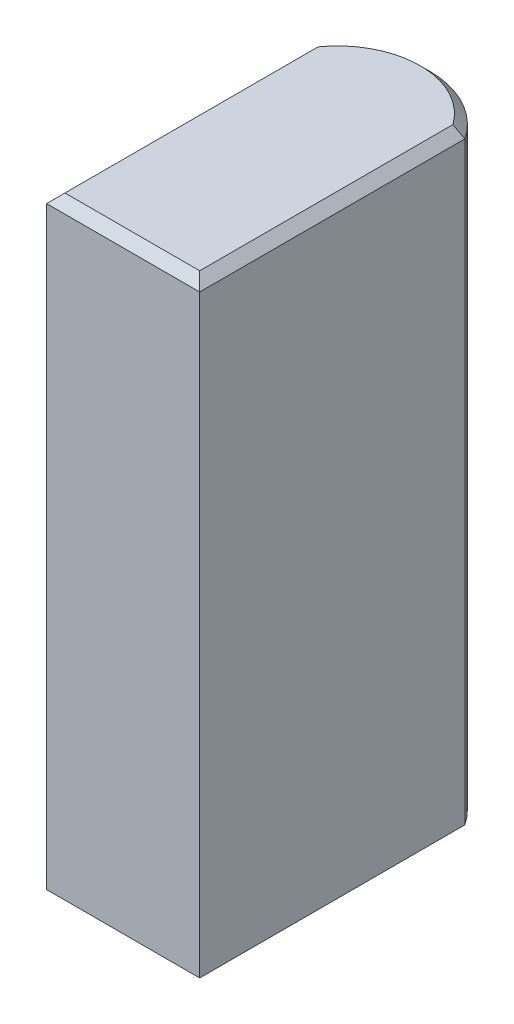
ISO-10303-21;
HEADER;
FILE_DESCRIPTION(('STEP AP214'),'2;1');
FILE_NAME('part.step','',(''),(''),'','','');
FILE_SCHEMA(('AUTOMOTIVE_DESIGN { 1 0 10303 214 1 1 1 1 }'));
ENDSEC;
DATA;
#1=APPLICATION_CONTEXT('core data for automotive mechanical design processes');
#2=APPLICATION_PROTOCOL_DEFINITION('international standard','automotive_design',2000,#1);
#3=PRODUCT_CONTEXT('',#1,'mechanical');
#4=PRODUCT('Part','Part','',(#3));
#5=PRODUCT_RELATED_PRODUCT_CATEGORY('part','',(#4));
#6=PRODUCT_DEFINITION_FORMATION('','',#4);
#7=PRODUCT_DEFINITION_CONTEXT('part definition',#1,'design');
#8=PRODUCT_DEFINITION('design','',#6,#7);
#9=PRODUCT_DEFINITION_SHAPE('','',#8);
#10=(LENGTH_UNIT() NAMED_UNIT(*) SI_UNIT(.MILLI.,.METRE.));
#11=(NAMED_UNIT(*) PLANE_ANGLE_UNIT() SI_UNIT($,.RADIAN.));
#12=(NAMED_UNIT(*) SI_UNIT($,.STERADIAN.) SOLID_ANGLE_UNIT());
#13=UNCERTAINTY_MEASURE_WITH_UNIT(LENGTH_MEASURE(1.E-05),#10,'distance_accuracy_value','');
#14=(GEOMETRIC_REPRESENTATION_CONTEXT(3) GLOBAL_UNCERTAINTY_ASSIGNED_CONTEXT((#13)) GLOBAL_UNIT_ASSIGNED_CONTEXT((#10,
#11,#12)) REPRESENTATION_CONTEXT('',''));
#15=CARTESIAN_POINT('',(0.,0.,0.));
#16=DIRECTION('',(0.,0.,1.));
#17=DIRECTION('',(1.,0.,0.));
#18=AXIS2_PLACEMENT_3D('',#15,#16,#17);
#19=CARTESIAN_POINT('',(0.,20.0000000000001,-7.00000000000009));
#20=DIRECTION('',(0.,-1.,0.));
#21=DIRECTION('',(0.,0.,-0.999999999999997));
#22=AXIS2_PLACEMENT_3D('',#19,#20,#21);
#23=CYLINDRICAL_SURFACE('',#22,3.);
#24=DIRECTION('',(0.,-1.,0.));
#25=VECTOR('',#24,1.);
#26=CARTESIAN_POINT('',(2.5,20.,-8.65831239517778));
#27=LINE('',#26,#25);
#28=CARTESIAN_POINT('',(2.5,19.7,-8.65831239517778));
#29=VERTEX_POINT('',#28);
#30=CARTESIAN_POINT('',(2.5,0.300000000000068,-8.65831239517762));
#31=VERTEX_POINT('',#30);
#32=EDGE_CURVE('E198',#29,#31,#27,.T.);
#33=ORIENTED_EDGE('',*,*,#32,.T.);
#34=CARTESIAN_POINT('',(0.,0.300000000000054,-6.99999999999996));
#35=DIRECTION('',(0.,-1.,0.));
#36=DIRECTION('',(0.,0.,-0.999999999999997));
#37=AXIS2_PLACEMENT_3D('',#34,#35,#36);
#38=CIRCLE('',#37,3.);
#39=CARTESIAN_POINT('',(-2.5,0.300000000000068,-8.65831239517762));
#40=VERTEX_POINT('',#39);
#41=EDGE_CURVE('E240',#31,#40,#38,.F.);
#42=ORIENTED_EDGE('',*,*,#41,.T.);
#43=DIRECTION('',(0.,-1.,0.));
#44=VECTOR('',#43,1.);
#45=CARTESIAN_POINT('',(-2.5,20.,-8.65831239517778));
#46=LINE('',#45,#44);
#47=CARTESIAN_POINT('',(-2.5,19.7,-8.65831239517778));
#48=VERTEX_POINT('',#47);
#49=EDGE_CURVE('E137',#48,#40,#46,.T.);
#50=ORIENTED_EDGE('',*,*,#49,.F.);
#51=CARTESIAN_POINT('',(0.,19.7000000000001,-7.00000000000012));
#52=DIRECTION('',(0.,-1.,0.));
#53=DIRECTION('',(0.,0.,-0.999999999999997));
#54=AXIS2_PLACEMENT_3D('',#51,#52,#53);
#55=CIRCLE('',#54,3.);
#56=EDGE_CURVE('E243',#48,#29,#55,.T.);
#57=ORIENTED_EDGE('',*,*,#56,.T.);
#58=EDGE_LOOP('',(#33,#42,#50,#57));
#59=FACE_BOUND('',#58,.T.);
#60=ADVANCED_FACE('F46',(#59),#23,.T.);
#61=CARTESIAN_POINT('',(-2.5,20.,-1.66533453693773E-13));
#62=DIRECTION('',(1.,0.,0.));
#63=DIRECTION('',(0.,0.,-0.999999999999997));
#64=AXIS2_PLACEMENT_3D('',#61,#62,#63);
#65=PLANE('',#64);
#66=ORIENTED_EDGE('',*,*,#49,.T.);
#67=DIRECTION('',(0.,0.,0.999999999999997));
#68=VECTOR('',#67,1.);
#69=CARTESIAN_POINT('',(-2.5,0.299999999999998,0.));
#70=LINE('',#69,#68);
#71=CARTESIAN_POINT('',(-2.5,0.299999999999998,0.));
#72=VERTEX_POINT('',#71);
#73=EDGE_CURVE('E135',#40,#72,#70,.T.);
#74=ORIENTED_EDGE('',*,*,#73,.T.);
#75=DIRECTION('',(0.,-1.,0.));
#76=VECTOR('',#75,1.);
#77=CARTESIAN_POINT('',(-2.5,20.,-1.66533453693773E-13));
#78=LINE('',#77,#76);
#79=CARTESIAN_POINT('',(-2.5,19.7,-1.66533453693773E-13));
#80=VERTEX_POINT('',#79);
#81=EDGE_CURVE('E117',#80,#72,#78,.T.);
#82=ORIENTED_EDGE('',*,*,#81,.F.);
#83=DIRECTION('',(0.,0.,-0.999999999999997));
#84=VECTOR('',#83,1.);
#85=CARTESIAN_POINT('',(-2.5,19.7,-1.66533453693773E-13));
#86=LINE('',#85,#84);
#87=EDGE_CURVE('E132',#80,#48,#86,.T.);
#88=ORIENTED_EDGE('',*,*,#87,.T.);
#89=EDGE_LOOP('',(#66,#74,#82,#88));
#90=FACE_BOUND('',#89,.T.);
#91=ADVANCED_FACE('F131',(#90),#65,.F.);
#92=CARTESIAN_POINT('',(2.5,20.,-1.66533453693773E-13));
#93=DIRECTION('',(0.,0.,-0.999999999999997));
#94=DIRECTION('',(-1.,0.,0.));
#95=AXIS2_PLACEMENT_3D('',#92,#93,#94);
#96=PLANE('',#95);
#97=ORIENTED_EDGE('',*,*,#81,.T.);
#98=DIRECTION('',(1.,0.,0.));
#99=VECTOR('',#98,1.);
#100=CARTESIAN_POINT('',(2.5,0.299999999999998,0.));
#101=LINE('',#100,#99);
#102=CARTESIAN_POINT('',(2.5,0.299999999999998,0.));
#103=VERTEX_POINT('',#102);
#104=EDGE_CURVE('E124',#72,#103,#101,.T.);
#105=ORIENTED_EDGE('',*,*,#104,.T.);
#106=DIRECTION('',(0.,-1.,0.));
#107=VECTOR('',#106,1.);
#108=CARTESIAN_POINT('',(2.5,20.,-1.66533453693773E-13));
#109=LINE('',#108,#107);
#110=CARTESIAN_POINT('',(2.5,19.7,-1.66533453693773E-13));
#111=VERTEX_POINT('',#110);
#112=EDGE_CURVE('E119',#111,#103,#109,.T.);
#113=ORIENTED_EDGE('',*,*,#112,.F.);
#114=DIRECTION('',(-1.,0.,0.));
#115=VECTOR('',#114,1.);
#116=CARTESIAN_POINT('',(2.5,19.7,-1.66533453693773E-13));
#117=LINE('',#116,#115);
#118=EDGE_CURVE('E114',#111,#80,#117,.T.);
#119=ORIENTED_EDGE('',*,*,#118,.T.);
#120=EDGE_LOOP('',(#97,#105,#113,#119));
#121=FACE_BOUND('',#120,.T.);
#122=ADVANCED_FACE('F116',(#121),#96,.F.);
#123=CARTESIAN_POINT('',(2.5,20.,-1.66533453693773E-13));
#124=DIRECTION('',(-1.,0.,0.));
#125=DIRECTION('',(0.,0.,0.999999999999997));
#126=AXIS2_PLACEMENT_3D('',#123,#124,#125);
#127=PLANE('',#126);
#128=ORIENTED_EDGE('',*,*,#112,.T.);
#129=DIRECTION('',(0.,0.,-0.999999999999997));
#130=VECTOR('',#129,1.);
#131=CARTESIAN_POINT('',(2.5,0.300000000000068,-8.65831239517762));
#132=LINE('',#131,#130);
#133=EDGE_CURVE('E246',#103,#31,#132,.T.);
#134=ORIENTED_EDGE('',*,*,#133,.T.);
#135=ORIENTED_EDGE('',*,*,#32,.F.);
#136=DIRECTION('',(0.,0.,0.999999999999997));
#137=VECTOR('',#136,1.);
#138=CARTESIAN_POINT('',(2.5,19.7,-1.66533453693773E-13));
#139=LINE('',#138,#137);
#140=EDGE_CURVE('E249',#29,#111,#139,.T.);
#141=ORIENTED_EDGE('',*,*,#140,.T.);
#142=EDGE_LOOP('',(#128,#134,#135,#141));
#143=FACE_BOUND('',#142,.T.);
#144=ADVANCED_FACE('F291',(#143),#127,.F.);
#145=CARTESIAN_POINT('',(0.,20.0000000000001,-7.00000000000009));
#146=DIRECTION('',(0.,-1.,0.));
#147=DIRECTION('',(0.,0.,-0.999999999999997));
#148=AXIS2_PLACEMENT_3D('',#145,#146,#147);
#149=PLANE('',#148);
#150=DIRECTION('',(1.,0.,0.));
#151=VECTOR('',#150,1.);
#152=CARTESIAN_POINT('',(0.,20.,-0.300000000000168));
#153=LINE('',#152,#151);
#154=CARTESIAN_POINT('',(-2.2,20.,-0.300000000000168));
#155=VERTEX_POINT('',#154);
#156=CARTESIAN_POINT('',(2.2,20.,-0.300000000000168));
#157=VERTEX_POINT('',#156);
#158=EDGE_CURVE('E57',#155,#157,#153,.T.);
#159=ORIENTED_EDGE('',*,*,#158,.T.);
#160=DIRECTION('',(0.,0.,-0.999999999999997));
#161=VECTOR('',#160,1.);
#162=CARTESIAN_POINT('',(2.2,20.0000000000001,-7.00000000000009));
#163=LINE('',#162,#161);
#164=CARTESIAN_POINT('',(2.19999999999979,20.,-8.56524758425023));
#165=VERTEX_POINT('',#164);
#166=EDGE_CURVE('E11',#157,#165,#163,.T.);
#167=ORIENTED_EDGE('',*,*,#166,.T.);
#168=CARTESIAN_POINT('',(0.,20.0000000000001,-7.00000000000009));
#169=DIRECTION('',(0.,-1.,0.));
#170=DIRECTION('',(0.,0.,-0.999999999999997));
#171=AXIS2_PLACEMENT_3D('',#168,#169,#170);
#172=CIRCLE('',#171,2.7);
#173=CARTESIAN_POINT('',(-2.19999999999979,20.,-8.56524758425023));
#174=VERTEX_POINT('',#173);
#175=EDGE_CURVE('E237',#165,#174,#172,.F.);
#176=ORIENTED_EDGE('',*,*,#175,.T.);
#177=DIRECTION('',(0.,0.,0.999999999999997));
#178=VECTOR('',#177,1.);
#179=CARTESIAN_POINT('',(-2.2,20.0000000000001,-7.00000000000009));
#180=LINE('',#179,#178);
#181=EDGE_CURVE('E68',#174,#155,#180,.T.);
#182=ORIENTED_EDGE('',*,*,#181,.T.);
#183=EDGE_LOOP('',(#159,#167,#176,#182));
#184=FACE_BOUND('',#183,.T.);
#185=ADVANCED_FACE('F294',(#184),#149,.F.);
#186=CARTESIAN_POINT('',(0.,0.,-6.99999999999996));
#187=DIRECTION('',(0.,-1.,0.));
#188=DIRECTION('',(0.,0.,-0.999999999999997));
#189=AXIS2_PLACEMENT_3D('',#186,#187,#188);
#190=PLANE('',#189);
#191=DIRECTION('',(-1.,0.,0.));
#192=VECTOR('',#191,1.);
#193=CARTESIAN_POINT('',(-2.5,0.,-0.300000000000002));
#194=LINE('',#193,#192);
#195=CARTESIAN_POINT('',(2.2,0.,-0.300000000000002));
#196=VERTEX_POINT('',#195);
#197=CARTESIAN_POINT('',(-2.2,0.,-0.300000000000002));
#198=VERTEX_POINT('',#197);
#199=EDGE_CURVE('E257',#196,#198,#194,.T.);
#200=ORIENTED_EDGE('',*,*,#199,.T.);
#201=DIRECTION('',(0.,0.,-0.999999999999997));
#202=VECTOR('',#201,1.);
#203=CARTESIAN_POINT('',(-2.2,0.,-8.65831239517762));
#204=LINE('',#203,#202);
#205=CARTESIAN_POINT('',(-2.19999999999979,0.,-8.56524758425007));
#206=VERTEX_POINT('',#205);
#207=EDGE_CURVE('E125',#198,#206,#204,.T.);
#208=ORIENTED_EDGE('',*,*,#207,.T.);
#209=CARTESIAN_POINT('',(0.,0.,-6.99999999999996));
#210=DIRECTION('',(0.,-1.,0.));
#211=DIRECTION('',(0.,0.,-0.999999999999997));
#212=AXIS2_PLACEMENT_3D('',#209,#210,#211);
#213=CIRCLE('',#212,2.7);
#214=CARTESIAN_POINT('',(2.19999999999979,0.,-8.56524758425007));
#215=VERTEX_POINT('',#214);
#216=EDGE_CURVE('E263',#206,#215,#213,.T.);
#217=ORIENTED_EDGE('',*,*,#216,.T.);
#218=DIRECTION('',(0.,0.,0.999999999999997));
#219=VECTOR('',#218,1.);
#220=CARTESIAN_POINT('',(2.2,0.,0.));
#221=LINE('',#220,#219);
#222=EDGE_CURVE('E260',#215,#196,#221,.T.);
#223=ORIENTED_EDGE('',*,*,#222,.T.);
#224=EDGE_LOOP('',(#200,#208,#217,#223));
#225=FACE_BOUND('',#224,.T.);
#226=ADVANCED_FACE('F214',(#225),#190,.T.);
#227=CARTESIAN_POINT('',(2.5,0.299999999999998,0.));
#228=DIRECTION('',(0.707106781186545,-0.70710678118655,0.));
#229=DIRECTION('',(0.,0.,0.999999999999997));
#230=AXIS2_PLACEMENT_3D('',#227,#228,#229);
#231=PLANE('',#230);
#232=DIRECTION('',(-0.577350269189628,-0.577350269189619,-0.57735026918962));
#233=VECTOR('',#232,1.);
#234=CARTESIAN_POINT('',(2.5,0.299999999999998,0.));
#235=LINE('',#234,#233);
#236=EDGE_CURVE('E199',#196,#103,#235,.F.);
#237=ORIENTED_EDGE('',*,*,#236,.F.);
#238=ORIENTED_EDGE('',*,*,#222,.F.);
#239=CARTESIAN_POINT('',(2.5,0.300000000000068,-8.65831239517762));
#240=CARTESIAN_POINT('',(2.44993376791135,0.249933767911329,-8.64322876187367));
#241=CARTESIAN_POINT('',(2.3999006638598,0.199900663859727,-8.62793154813898));
#242=CARTESIAN_POINT('',(2.29990066379614,0.0999006637960669,-8.59690994490694));
#243=CARTESIAN_POINT('',(2.24993376784768,0.0499337678476608,-8.58118555499922));
#244=CARTESIAN_POINT('',(2.19999999999997,0.,-8.56524758425039));
#245=B_SPLINE_CURVE_WITH_KNOTS('',3,(#239,#240,#241,#242,#243,#244),.UNSPECIFIED.,.F.,.F.,(4,2,
4),(0.,0.217176540517284,0.434353289674991),.UNSPECIFIED.);
#246=EDGE_CURVE('E189',#31,#215,#245,.T.);
#247=ORIENTED_EDGE('',*,*,#246,.F.);
#248=ORIENTED_EDGE('',*,*,#133,.F.);
#249=EDGE_LOOP('',(#237,#238,#247,#248));
#250=FACE_BOUND('',#249,.T.);
#251=ADVANCED_FACE('F207',(#250),#231,.T.);
#252=CARTESIAN_POINT('',(0.,0.300000000000054,-6.99999999999996));
#253=DIRECTION('',(0.,1.,0.));
#254=DIRECTION('',(0.,0.,0.999999999999997));
#255=AXIS2_PLACEMENT_3D('',#252,#253,#254);
#256=CONICAL_SURFACE('',#255,3.,0.785398163397451);
#257=ORIENTED_EDGE('',*,*,#246,.T.);
#258=ORIENTED_EDGE('',*,*,#216,.F.);
#259=CARTESIAN_POINT('',(-2.2,0.,-8.56524758425021));
#260=CARTESIAN_POINT('',(-2.24993376784771,0.0499337678476907,-8.58118555499902));
#261=CARTESIAN_POINT('',(-2.29990066379616,0.0999006637960875,-8.59690994490679));
#262=CARTESIAN_POINT('',(-2.39990066385977,0.199900663859702,-8.62793154813912));
#263=CARTESIAN_POINT('',(-2.44993376791129,0.249933767911268,-8.64322876187405));
#264=CARTESIAN_POINT('',(-2.49999999999989,0.299999999999956,-8.65831239517832));
#265=B_SPLINE_CURVE_WITH_KNOTS('',3,(#259,#260,#261,#262,#263,#264),.UNSPECIFIED.,.F.,.F.,(4,2,
4),(0.,0.217176749157705,0.434353289674987),.UNSPECIFIED.);
#266=EDGE_CURVE('E151',#40,#206,#265,.F.);
#267=ORIENTED_EDGE('',*,*,#266,.F.);
#268=ORIENTED_EDGE('',*,*,#41,.F.);
#269=EDGE_LOOP('',(#257,#258,#267,#268));
#270=FACE_BOUND('',#269,.T.);
#271=ADVANCED_FACE('F202',(#270),#256,.T.);
#272=CARTESIAN_POINT('',(2.5,0.299999999999998,0.));
#273=DIRECTION('',(0.,-0.707106781186555,0.707106781186548));
#274=DIRECTION('',(-1.,0.,0.));
#275=AXIS2_PLACEMENT_3D('',#272,#273,#274);
#276=PLANE('',#275);
#277=ORIENTED_EDGE('',*,*,#236,.T.);
#278=ORIENTED_EDGE('',*,*,#104,.F.);
#279=DIRECTION('',(0.577350269189628,-0.577350269189619,-0.57735026918962));
#280=VECTOR('',#279,1.);
#281=CARTESIAN_POINT('',(-0.833333333333322,-1.36666666666665,-1.66666666666668));
#282=LINE('',#281,#280);
#283=EDGE_CURVE('E148',#198,#72,#282,.F.);
#284=ORIENTED_EDGE('',*,*,#283,.F.);
#285=ORIENTED_EDGE('',*,*,#199,.F.);
#286=EDGE_LOOP('',(#277,#278,#284,#285));
#287=FACE_BOUND('',#286,.T.);
#288=ADVANCED_FACE('F216',(#287),#276,.T.);
#289=CARTESIAN_POINT('',(-2.5,0.299999999999998,0.));
#290=DIRECTION('',(-0.707106781186545,-0.70710678118655,0.));
#291=DIRECTION('',(0.,0.,-0.999999999999997));
#292=AXIS2_PLACEMENT_3D('',#289,#290,#291);
#293=PLANE('',#292);
#294=ORIENTED_EDGE('',*,*,#266,.T.);
#295=ORIENTED_EDGE('',*,*,#207,.F.);
#296=ORIENTED_EDGE('',*,*,#283,.T.);
#297=ORIENTED_EDGE('',*,*,#73,.F.);
#298=EDGE_LOOP('',(#294,#295,#296,#297));
#299=FACE_BOUND('',#298,.T.);
#300=ADVANCED_FACE('F176',(#299),#293,.T.);
#301=CARTESIAN_POINT('',(-2.2,20.0000000000001,-7.00000000000009));
#302=DIRECTION('',(0.707106781186551,-0.707106781186544,0.));
#303=DIRECTION('',(0.,0.,0.999999999999997));
#304=AXIS2_PLACEMENT_3D('',#301,#302,#303);
#305=PLANE('',#304);
#306=CARTESIAN_POINT('',(-2.5,19.7,-8.65831239517778));
#307=CARTESIAN_POINT('',(-2.4499337679113,19.7500662320888,-8.64322876187393));
#308=CARTESIAN_POINT('',(-2.39990066385972,19.8000993361403,-8.62793154813928));
#309=CARTESIAN_POINT('',(-2.29990066379606,19.900099336204,-8.59690994490724));
#310=CARTESIAN_POINT('',(-2.24993376784763,19.9500662321524,-8.58118555499948));
#311=CARTESIAN_POINT('',(-2.19999999999997,20.0000000000001,-8.56524758425055));
#312=B_SPLINE_CURVE_WITH_KNOTS('',3,(#306,#307,#308,#309,#310,#311),.UNSPECIFIED.,.F.,.F.,(4,2,
4),(0.,0.21717654051729,0.434353289674998),.UNSPECIFIED.);
#313=EDGE_CURVE('E143',#48,#174,#312,.T.);
#314=ORIENTED_EDGE('',*,*,#313,.F.);
#315=ORIENTED_EDGE('',*,*,#87,.F.);
#316=DIRECTION('',(0.577350269189624,0.577350269189634,-0.577350269189624));
#317=VECTOR('',#316,1.);
#318=CARTESIAN_POINT('',(0.0333333333333188,22.2333333333333,-2.53333333333344));
#319=LINE('',#318,#317);
#320=EDGE_CURVE('E51',#155,#80,#319,.F.);
#321=ORIENTED_EDGE('',*,*,#320,.F.);
#322=ORIENTED_EDGE('',*,*,#181,.F.);
#323=EDGE_LOOP('',(#314,#315,#321,#322));
#324=FACE_BOUND('',#323,.T.);
#325=ADVANCED_FACE('F141',(#324),#305,.F.);
#326=CARTESIAN_POINT('',(0.,20.,-0.300000000000168));
#327=DIRECTION('',(0.,-0.707106781186538,-0.707106781186544));
#328=DIRECTION('',(1.,0.,0.));
#329=AXIS2_PLACEMENT_3D('',#326,#327,#328);
#330=PLANE('',#329);
#331=ORIENTED_EDGE('',*,*,#320,.T.);
#332=ORIENTED_EDGE('',*,*,#118,.F.);
#333=DIRECTION('',(-0.577350269189624,0.577350269189634,-0.577350269189624));
#334=VECTOR('',#333,1.);
#335=CARTESIAN_POINT('',(1.46666666666667,20.7333333333333,-1.0333333333335));
#336=LINE('',#335,#334);
#337=EDGE_CURVE('E153',#157,#111,#336,.F.);
#338=ORIENTED_EDGE('',*,*,#337,.F.);
#339=ORIENTED_EDGE('',*,*,#158,.F.);
#340=EDGE_LOOP('',(#331,#332,#338,#339));
#341=FACE_BOUND('',#340,.T.);
#342=ADVANCED_FACE('F49',(#341),#330,.F.);
#343=CARTESIAN_POINT('',(0.,20.0000000000001,-7.00000000000009));
#344=DIRECTION('',(0.,-1.,0.));
#345=DIRECTION('',(0.,0.,-0.999999999999997));
#346=AXIS2_PLACEMENT_3D('',#343,#344,#345);
#347=CONICAL_SURFACE('',#346,2.7,0.785398163397443);
#348=ORIENTED_EDGE('',*,*,#313,.T.);
#349=ORIENTED_EDGE('',*,*,#175,.F.);
#350=CARTESIAN_POINT('',(2.2,20.,-8.56524758425038));
#351=CARTESIAN_POINT('',(2.24993376784766,19.9500662321524,-8.58118555499928));
#352=CARTESIAN_POINT('',(2.29990066379608,19.900099336204,-8.59690994490709));
#353=CARTESIAN_POINT('',(2.39990066385969,19.8000993361404,-8.62793154813942));
#354=CARTESIAN_POINT('',(2.44993376791124,19.7500662320888,-8.64322876187431));
#355=CARTESIAN_POINT('',(2.49999999999989,19.7000000000001,-8.65831239517848));
#356=B_SPLINE_CURVE_WITH_KNOTS('',3,(#350,#351,#352,#353,#354,#355),.UNSPECIFIED.,.F.,.F.,(4,2,
4),(0.,0.217176749157707,0.434353289674994),.UNSPECIFIED.);
#357=EDGE_CURVE('E157',#29,#165,#356,.F.);
#358=ORIENTED_EDGE('',*,*,#357,.F.);
#359=ORIENTED_EDGE('',*,*,#56,.F.);
#360=EDGE_LOOP('',(#348,#349,#358,#359));
#361=FACE_BOUND('',#360,.T.);
#362=ADVANCED_FACE('F166',(#361),#347,.T.);
#363=CARTESIAN_POINT('',(2.2,20.0000000000001,-7.00000000000009));
#364=DIRECTION('',(-0.707106781186551,-0.707106781186544,0.));
#365=DIRECTION('',(0.,0.,-0.999999999999997));
#366=AXIS2_PLACEMENT_3D('',#363,#364,#365);
#367=PLANE('',#366);
#368=ORIENTED_EDGE('',*,*,#337,.T.);
#369=ORIENTED_EDGE('',*,*,#140,.F.);
#370=ORIENTED_EDGE('',*,*,#357,.T.);
#371=ORIENTED_EDGE('',*,*,#166,.F.);
#372=EDGE_LOOP('',(#368,#369,#370,#371));
#373=FACE_BOUND('',#372,.T.);
#374=ADVANCED_FACE('F177',(#373),#367,.F.);
#375=CLOSED_SHELL('',(#60,#91,#122,#144,#185,#226,#251,#271,#288,#300,#325,#342,#362,#374));
#376=MANIFOLD_SOLID_BREP('B2',#375);
#377=ADVANCED_BREP_SHAPE_REPRESENTATION('',(#18,#376),#14);
#378=SHAPE_DEFINITION_REPRESENTATION(#9,#377);
ENDSEC;
END-ISO-10303-21;
